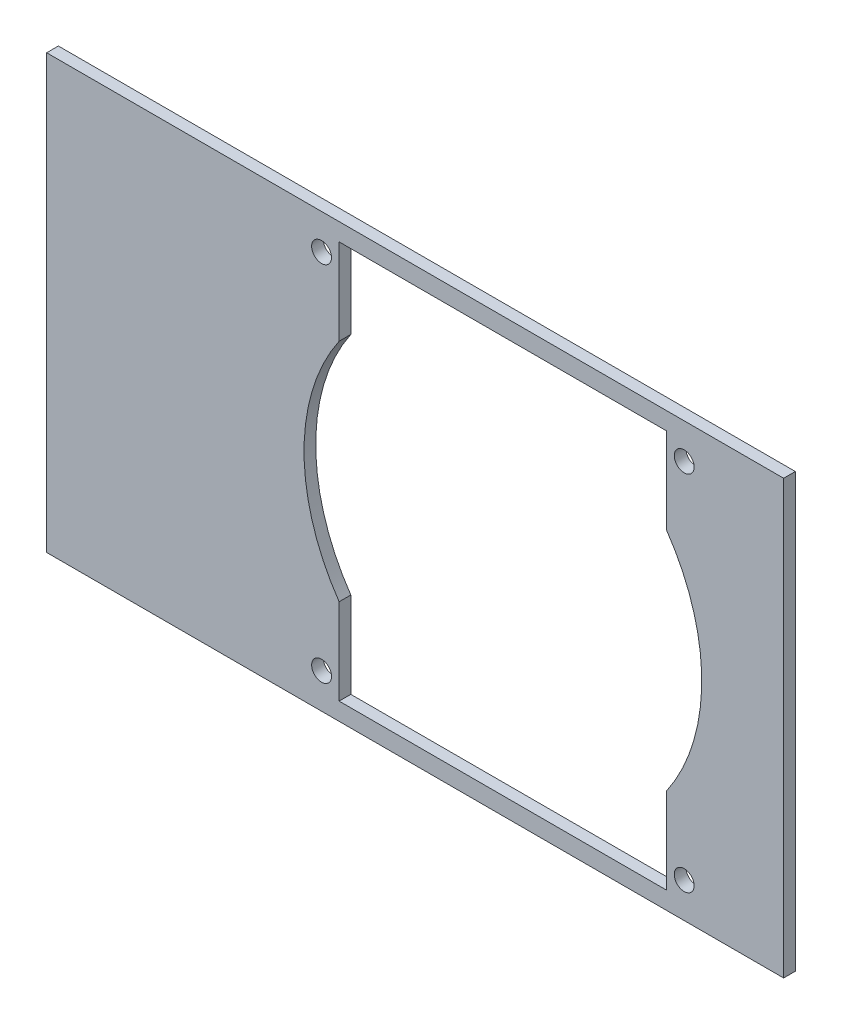
ISO-10303-21;
HEADER;
FILE_DESCRIPTION(('STEP AP214'),'2;1');
FILE_NAME('part.step','',(''),(''),'','','');
FILE_SCHEMA(('AUTOMOTIVE_DESIGN { 1 0 10303 214 1 1 1 1 }'));
ENDSEC;
DATA;
#1=APPLICATION_CONTEXT('core data for automotive mechanical design processes');
#2=APPLICATION_PROTOCOL_DEFINITION('international standard','automotive_design',2000,#1);
#3=PRODUCT_CONTEXT('',#1,'mechanical');
#4=PRODUCT('Part','Part','',(#3));
#5=PRODUCT_RELATED_PRODUCT_CATEGORY('part','',(#4));
#6=PRODUCT_DEFINITION_FORMATION('','',#4);
#7=PRODUCT_DEFINITION_CONTEXT('part definition',#1,'design');
#8=PRODUCT_DEFINITION('design','',#6,#7);
#9=PRODUCT_DEFINITION_SHAPE('','',#8);
#10=(LENGTH_UNIT() NAMED_UNIT(*) SI_UNIT(.MILLI.,.METRE.));
#11=(NAMED_UNIT(*) PLANE_ANGLE_UNIT() SI_UNIT($,.RADIAN.));
#12=(NAMED_UNIT(*) SI_UNIT($,.STERADIAN.) SOLID_ANGLE_UNIT());
#13=UNCERTAINTY_MEASURE_WITH_UNIT(LENGTH_MEASURE(1.E-05),#10,'distance_accuracy_value','');
#14=(GEOMETRIC_REPRESENTATION_CONTEXT(3) GLOBAL_UNCERTAINTY_ASSIGNED_CONTEXT((#13)) GLOBAL_UNIT_ASSIGNED_CONTEXT((#10,
#11,#12)) REPRESENTATION_CONTEXT('',''));
#15=CARTESIAN_POINT('',(0.,0.,0.));
#16=DIRECTION('',(0.,0.,1.));
#17=DIRECTION('',(1.,0.,0.));
#18=AXIS2_PLACEMENT_3D('',#15,#16,#17);
#19=CARTESIAN_POINT('',(0.,0.,2.));
#20=DIRECTION('',(0.,0.,-1.));
#21=DIRECTION('',(-1.,0.,0.));
#22=AXIS2_PLACEMENT_3D('',#19,#20,#21);
#23=PLANE('',#22);
#24=DIRECTION('',(0.,-1.,0.));
#25=VECTOR('',#24,1.);
#26=CARTESIAN_POINT('',(0.,-74.,2.));
#27=LINE('',#26,#25);
#28=CARTESIAN_POINT('',(0.,0.,2.));
#29=VERTEX_POINT('',#28);
#30=CARTESIAN_POINT('',(0.,-74.,2.));
#31=VERTEX_POINT('',#30);
#32=EDGE_CURVE('E190',#29,#31,#27,.T.);
#33=ORIENTED_EDGE('',*,*,#32,.T.);
#34=DIRECTION('',(1.,0.,0.));
#35=VECTOR('',#34,1.);
#36=CARTESIAN_POINT('',(126.,-74.,2.));
#37=LINE('',#36,#35);
#38=CARTESIAN_POINT('',(126.,-74.,2.));
#39=VERTEX_POINT('',#38);
#40=EDGE_CURVE('E193',#31,#39,#37,.T.);
#41=ORIENTED_EDGE('',*,*,#40,.T.);
#42=DIRECTION('',(0.,1.,0.));
#43=VECTOR('',#42,1.);
#44=CARTESIAN_POINT('',(126.,0.,2.));
#45=LINE('',#44,#43);
#46=CARTESIAN_POINT('',(126.,0.,2.));
#47=VERTEX_POINT('',#46);
#48=EDGE_CURVE('E196',#39,#47,#45,.T.);
#49=ORIENTED_EDGE('',*,*,#48,.T.);
#50=DIRECTION('',(-1.,0.,0.));
#51=VECTOR('',#50,1.);
#52=CARTESIAN_POINT('',(0.,0.,2.));
#53=LINE('',#52,#51);
#54=EDGE_CURVE('E198',#47,#29,#53,.T.);
#55=ORIENTED_EDGE('',*,*,#54,.T.);
#56=EDGE_LOOP('',(#33,#41,#49,#55));
#57=FACE_BOUND('',#56,.T.);
#58=DIRECTION('',(0.,-1.,0.));
#59=VECTOR('',#58,1.);
#60=CARTESIAN_POINT('',(50.,-56.287301521986,2.));
#61=LINE('',#60,#59);
#62=CARTESIAN_POINT('',(50.,-56.287301521986,2.));
#63=VERTEX_POINT('',#62);
#64=CARTESIAN_POINT('',(50.,-71.,2.));
#65=VERTEX_POINT('',#64);
#66=EDGE_CURVE('E122',#63,#65,#61,.T.);
#67=ORIENTED_EDGE('',*,*,#66,.F.);
#68=CARTESIAN_POINT('',(78.,-37.,2.));
#69=DIRECTION('',(0.,0.,1.));
#70=DIRECTION('',(1.,0.,0.));
#71=AXIS2_PLACEMENT_3D('',#68,#69,#70);
#72=CIRCLE('',#71,34.);
#73=CARTESIAN_POINT('',(50.,-17.7126984780141,2.));
#74=VERTEX_POINT('',#73);
#75=EDGE_CURVE('E157',#74,#63,#72,.T.);
#76=ORIENTED_EDGE('',*,*,#75,.F.);
#77=DIRECTION('',(0.,-1.,0.));
#78=VECTOR('',#77,1.);
#79=CARTESIAN_POINT('',(50.,-2.99999999999999,2.));
#80=LINE('',#79,#78);
#81=CARTESIAN_POINT('',(50.,-2.99999999999999,2.));
#82=VERTEX_POINT('',#81);
#83=EDGE_CURVE('E155',#82,#74,#80,.T.);
#84=ORIENTED_EDGE('',*,*,#83,.F.);
#85=DIRECTION('',(-1.,0.,0.));
#86=VECTOR('',#85,1.);
#87=CARTESIAN_POINT('',(50.,-2.99999999999999,2.));
#88=LINE('',#87,#86);
#89=CARTESIAN_POINT('',(106.,-2.99999999999999,2.));
#90=VERTEX_POINT('',#89);
#91=EDGE_CURVE('E153',#90,#82,#88,.T.);
#92=ORIENTED_EDGE('',*,*,#91,.F.);
#93=DIRECTION('',(0.,1.,0.));
#94=VECTOR('',#93,1.);
#95=CARTESIAN_POINT('',(106.,-2.99999999999999,2.));
#96=LINE('',#95,#94);
#97=CARTESIAN_POINT('',(106.,-17.712698478014,2.));
#98=VERTEX_POINT('',#97);
#99=EDGE_CURVE('E151',#98,#90,#96,.T.);
#100=ORIENTED_EDGE('',*,*,#99,.F.);
#101=CARTESIAN_POINT('',(78.,-37.,2.));
#102=DIRECTION('',(0.,0.,1.));
#103=DIRECTION('',(1.,0.,0.));
#104=AXIS2_PLACEMENT_3D('',#101,#102,#103);
#105=CIRCLE('',#104,34.);
#106=CARTESIAN_POINT('',(106.,-56.287301521986,2.));
#107=VERTEX_POINT('',#106);
#108=EDGE_CURVE('E146',#107,#98,#105,.T.);
#109=ORIENTED_EDGE('',*,*,#108,.F.);
#110=DIRECTION('',(0.,1.,0.));
#111=VECTOR('',#110,1.);
#112=CARTESIAN_POINT('',(106.,-56.287301521986,2.));
#113=LINE('',#112,#111);
#114=CARTESIAN_POINT('',(106.,-71.,2.));
#115=VERTEX_POINT('',#114);
#116=EDGE_CURVE('E144',#115,#107,#113,.T.);
#117=ORIENTED_EDGE('',*,*,#116,.F.);
#118=DIRECTION('',(1.,0.,0.));
#119=VECTOR('',#118,1.);
#120=CARTESIAN_POINT('',(50.,-71.,2.));
#121=LINE('',#120,#119);
#122=EDGE_CURVE('E130',#65,#115,#121,.T.);
#123=ORIENTED_EDGE('',*,*,#122,.F.);
#124=EDGE_LOOP('',(#67,#76,#84,#92,#100,#109,#117,#123));
#125=FACE_BOUND('',#124,.T.);
#126=CARTESIAN_POINT('',(47.,-6.00000000000002,2.));
#127=DIRECTION('',(0.,0.,1.));
#128=DIRECTION('',(1.,0.,0.));
#129=AXIS2_PLACEMENT_3D('',#126,#127,#128);
#130=CIRCLE('',#129,1.7);
#131=CARTESIAN_POINT('',(48.7,-6.00000000000002,2.));
#132=VERTEX_POINT('',#131);
#133=EDGE_CURVE('E160',#132,#132,#130,.T.);
#134=ORIENTED_EDGE('',*,*,#133,.F.);
#135=EDGE_LOOP('',(#134));
#136=FACE_BOUND('',#135,.T.);
#137=CARTESIAN_POINT('',(109.,-6.00000000000002,2.));
#138=DIRECTION('',(0.,0.,1.));
#139=DIRECTION('',(1.,0.,0.));
#140=AXIS2_PLACEMENT_3D('',#137,#138,#139);
#141=CIRCLE('',#140,1.70000000000001);
#142=CARTESIAN_POINT('',(110.7,-6.00000000000002,2.));
#143=VERTEX_POINT('',#142);
#144=EDGE_CURVE('E318',#143,#143,#141,.T.);
#145=ORIENTED_EDGE('',*,*,#144,.F.);
#146=EDGE_LOOP('',(#145));
#147=FACE_BOUND('',#146,.T.);
#148=CARTESIAN_POINT('',(47.,-68.,2.));
#149=DIRECTION('',(0.,0.,1.));
#150=DIRECTION('',(1.,0.,0.));
#151=AXIS2_PLACEMENT_3D('',#148,#149,#150);
#152=CIRCLE('',#151,1.7);
#153=CARTESIAN_POINT('',(48.7,-68.,2.));
#154=VERTEX_POINT('',#153);
#155=EDGE_CURVE('E312',#154,#154,#152,.T.);
#156=ORIENTED_EDGE('',*,*,#155,.F.);
#157=EDGE_LOOP('',(#156));
#158=FACE_BOUND('',#157,.T.);
#159=CARTESIAN_POINT('',(109.,-68.,2.));
#160=DIRECTION('',(0.,0.,1.));
#161=DIRECTION('',(1.,0.,0.));
#162=AXIS2_PLACEMENT_3D('',#159,#160,#161);
#163=CIRCLE('',#162,1.7);
#164=CARTESIAN_POINT('',(110.7,-68.,2.));
#165=VERTEX_POINT('',#164);
#166=EDGE_CURVE('E303',#165,#165,#163,.T.);
#167=ORIENTED_EDGE('',*,*,#166,.F.);
#168=EDGE_LOOP('',(#167));
#169=FACE_BOUND('',#168,.T.);
#170=ADVANCED_FACE('F33',(#57,#125,#136,#147,#158,#169),#23,.F.);
#171=CARTESIAN_POINT('',(0.,0.,0.));
#172=DIRECTION('',(0.,0.,-1.));
#173=DIRECTION('',(-1.,0.,0.));
#174=AXIS2_PLACEMENT_3D('',#171,#172,#173);
#175=PLANE('',#174);
#176=CARTESIAN_POINT('',(47.,-68.,0.));
#177=DIRECTION('',(0.,0.,1.));
#178=DIRECTION('',(1.,0.,0.));
#179=AXIS2_PLACEMENT_3D('',#176,#177,#178);
#180=CIRCLE('',#179,1.7);
#181=CARTESIAN_POINT('',(48.7,-68.,0.));
#182=VERTEX_POINT('',#181);
#183=EDGE_CURVE('E309',#182,#182,#180,.T.);
#184=ORIENTED_EDGE('',*,*,#183,.T.);
#185=EDGE_LOOP('',(#184));
#186=FACE_BOUND('',#185,.T.);
#187=CARTESIAN_POINT('',(47.,-6.00000000000002,0.));
#188=DIRECTION('',(0.,0.,1.));
#189=DIRECTION('',(1.,0.,0.));
#190=AXIS2_PLACEMENT_3D('',#187,#188,#189);
#191=CIRCLE('',#190,1.7);
#192=CARTESIAN_POINT('',(48.7,-6.00000000000002,0.));
#193=VERTEX_POINT('',#192);
#194=EDGE_CURVE('E321',#193,#193,#191,.T.);
#195=ORIENTED_EDGE('',*,*,#194,.T.);
#196=EDGE_LOOP('',(#195));
#197=FACE_BOUND('',#196,.T.);
#198=DIRECTION('',(0.,-1.,0.));
#199=VECTOR('',#198,1.);
#200=CARTESIAN_POINT('',(0.,-74.,0.));
#201=LINE('',#200,#199);
#202=CARTESIAN_POINT('',(0.,0.,0.));
#203=VERTEX_POINT('',#202);
#204=CARTESIAN_POINT('',(0.,-74.,0.));
#205=VERTEX_POINT('',#204);
#206=EDGE_CURVE('E138',#203,#205,#201,.T.);
#207=ORIENTED_EDGE('',*,*,#206,.F.);
#208=DIRECTION('',(-1.,0.,0.));
#209=VECTOR('',#208,1.);
#210=CARTESIAN_POINT('',(0.,0.,0.));
#211=LINE('',#210,#209);
#212=CARTESIAN_POINT('',(126.,0.,0.));
#213=VERTEX_POINT('',#212);
#214=EDGE_CURVE('E194',#213,#203,#211,.T.);
#215=ORIENTED_EDGE('',*,*,#214,.F.);
#216=DIRECTION('',(0.,1.,0.));
#217=VECTOR('',#216,1.);
#218=CARTESIAN_POINT('',(126.,0.,0.));
#219=LINE('',#218,#217);
#220=CARTESIAN_POINT('',(126.,-74.,0.));
#221=VERTEX_POINT('',#220);
#222=EDGE_CURVE('E205',#221,#213,#219,.T.);
#223=ORIENTED_EDGE('',*,*,#222,.F.);
#224=DIRECTION('',(1.,0.,0.));
#225=VECTOR('',#224,1.);
#226=CARTESIAN_POINT('',(126.,-74.,0.));
#227=LINE('',#226,#225);
#228=EDGE_CURVE('E203',#205,#221,#227,.T.);
#229=ORIENTED_EDGE('',*,*,#228,.F.);
#230=EDGE_LOOP('',(#207,#215,#223,#229));
#231=FACE_BOUND('',#230,.T.);
#232=CARTESIAN_POINT('',(78.,-37.,0.));
#233=DIRECTION('',(0.,0.,1.));
#234=DIRECTION('',(1.,0.,0.));
#235=AXIS2_PLACEMENT_3D('',#232,#233,#234);
#236=CIRCLE('',#235,34.);
#237=CARTESIAN_POINT('',(50.,-17.7126984780141,0.));
#238=VERTEX_POINT('',#237);
#239=CARTESIAN_POINT('',(50.,-56.287301521986,0.));
#240=VERTEX_POINT('',#239);
#241=EDGE_CURVE('E131',#238,#240,#236,.T.);
#242=ORIENTED_EDGE('',*,*,#241,.T.);
#243=DIRECTION('',(0.,-1.,0.));
#244=VECTOR('',#243,1.);
#245=CARTESIAN_POINT('',(50.,-56.287301521986,0.));
#246=LINE('',#245,#244);
#247=CARTESIAN_POINT('',(50.,-71.,0.));
#248=VERTEX_POINT('',#247);
#249=EDGE_CURVE('E56',#240,#248,#246,.T.);
#250=ORIENTED_EDGE('',*,*,#249,.T.);
#251=DIRECTION('',(1.,0.,0.));
#252=VECTOR('',#251,1.);
#253=CARTESIAN_POINT('',(50.,-71.,0.));
#254=LINE('',#253,#252);
#255=CARTESIAN_POINT('',(106.,-71.,0.));
#256=VERTEX_POINT('',#255);
#257=EDGE_CURVE('E137',#248,#256,#254,.T.);
#258=ORIENTED_EDGE('',*,*,#257,.T.);
#259=DIRECTION('',(0.,1.,0.));
#260=VECTOR('',#259,1.);
#261=CARTESIAN_POINT('',(106.,-56.287301521986,0.));
#262=LINE('',#261,#260);
#263=CARTESIAN_POINT('',(106.,-56.287301521986,0.));
#264=VERTEX_POINT('',#263);
#265=EDGE_CURVE('E162',#256,#264,#262,.T.);
#266=ORIENTED_EDGE('',*,*,#265,.T.);
#267=CARTESIAN_POINT('',(78.,-37.,0.));
#268=DIRECTION('',(0.,0.,1.));
#269=DIRECTION('',(1.,0.,0.));
#270=AXIS2_PLACEMENT_3D('',#267,#268,#269);
#271=CIRCLE('',#270,34.);
#272=CARTESIAN_POINT('',(106.,-17.712698478014,0.));
#273=VERTEX_POINT('',#272);
#274=EDGE_CURVE('E165',#264,#273,#271,.T.);
#275=ORIENTED_EDGE('',*,*,#274,.T.);
#276=DIRECTION('',(0.,1.,0.));
#277=VECTOR('',#276,1.);
#278=CARTESIAN_POINT('',(106.,-2.99999999999999,0.));
#279=LINE('',#278,#277);
#280=CARTESIAN_POINT('',(106.,-2.99999999999999,0.));
#281=VERTEX_POINT('',#280);
#282=EDGE_CURVE('E168',#273,#281,#279,.T.);
#283=ORIENTED_EDGE('',*,*,#282,.T.);
#284=DIRECTION('',(-1.,0.,0.));
#285=VECTOR('',#284,1.);
#286=CARTESIAN_POINT('',(50.,-2.99999999999999,0.));
#287=LINE('',#286,#285);
#288=CARTESIAN_POINT('',(50.,-2.99999999999999,0.));
#289=VERTEX_POINT('',#288);
#290=EDGE_CURVE('E171',#281,#289,#287,.T.);
#291=ORIENTED_EDGE('',*,*,#290,.T.);
#292=DIRECTION('',(0.,-1.,0.));
#293=VECTOR('',#292,1.);
#294=CARTESIAN_POINT('',(50.,-2.99999999999999,0.));
#295=LINE('',#294,#293);
#296=EDGE_CURVE('E174',#289,#238,#295,.T.);
#297=ORIENTED_EDGE('',*,*,#296,.T.);
#298=EDGE_LOOP('',(#242,#250,#258,#266,#275,#283,#291,#297));
#299=FACE_BOUND('',#298,.T.);
#300=CARTESIAN_POINT('',(109.,-6.00000000000002,0.));
#301=DIRECTION('',(0.,0.,1.));
#302=DIRECTION('',(1.,0.,0.));
#303=AXIS2_PLACEMENT_3D('',#300,#301,#302);
#304=CIRCLE('',#303,1.70000000000001);
#305=CARTESIAN_POINT('',(110.7,-6.00000000000002,0.));
#306=VERTEX_POINT('',#305);
#307=EDGE_CURVE('E315',#306,#306,#304,.T.);
#308=ORIENTED_EDGE('',*,*,#307,.T.);
#309=EDGE_LOOP('',(#308));
#310=FACE_BOUND('',#309,.T.);
#311=CARTESIAN_POINT('',(109.,-68.,0.));
#312=DIRECTION('',(0.,0.,1.));
#313=DIRECTION('',(1.,0.,0.));
#314=AXIS2_PLACEMENT_3D('',#311,#312,#313);
#315=CIRCLE('',#314,1.7);
#316=CARTESIAN_POINT('',(110.7,-68.,0.));
#317=VERTEX_POINT('',#316);
#318=EDGE_CURVE('E306',#317,#317,#315,.T.);
#319=ORIENTED_EDGE('',*,*,#318,.T.);
#320=EDGE_LOOP('',(#319));
#321=FACE_BOUND('',#320,.T.);
#322=ADVANCED_FACE('F223',(#186,#197,#231,#299,#310,#321),#175,.T.);
#323=CARTESIAN_POINT('',(0.,-74.,2.));
#324=DIRECTION('',(1.,0.,0.));
#325=DIRECTION('',(0.,0.,-1.));
#326=AXIS2_PLACEMENT_3D('',#323,#324,#325);
#327=PLANE('',#326);
#328=ORIENTED_EDGE('',*,*,#206,.T.);
#329=DIRECTION('',(0.,0.,-1.));
#330=VECTOR('',#329,1.);
#331=CARTESIAN_POINT('',(0.,-74.,2.));
#332=LINE('',#331,#330);
#333=EDGE_CURVE('E11',#31,#205,#332,.T.);
#334=ORIENTED_EDGE('',*,*,#333,.F.);
#335=ORIENTED_EDGE('',*,*,#32,.F.);
#336=DIRECTION('',(0.,0.,-1.));
#337=VECTOR('',#336,1.);
#338=CARTESIAN_POINT('',(0.,0.,2.));
#339=LINE('',#338,#337);
#340=EDGE_CURVE('E200',#29,#203,#339,.T.);
#341=ORIENTED_EDGE('',*,*,#340,.T.);
#342=EDGE_LOOP('',(#328,#334,#335,#341));
#343=FACE_BOUND('',#342,.T.);
#344=ADVANCED_FACE('F35',(#343),#327,.F.);
#345=CARTESIAN_POINT('',(126.,-74.,2.));
#346=DIRECTION('',(0.,1.,0.));
#347=DIRECTION('',(-1.,0.,0.));
#348=AXIS2_PLACEMENT_3D('',#345,#346,#347);
#349=PLANE('',#348);
#350=ORIENTED_EDGE('',*,*,#228,.T.);
#351=DIRECTION('',(0.,0.,-1.));
#352=VECTOR('',#351,1.);
#353=CARTESIAN_POINT('',(126.,-74.,2.));
#354=LINE('',#353,#352);
#355=EDGE_CURVE('E41',#39,#221,#354,.T.);
#356=ORIENTED_EDGE('',*,*,#355,.F.);
#357=ORIENTED_EDGE('',*,*,#40,.F.);
#358=ORIENTED_EDGE('',*,*,#333,.T.);
#359=EDGE_LOOP('',(#350,#356,#357,#358));
#360=FACE_BOUND('',#359,.T.);
#361=ADVANCED_FACE('F233',(#360),#349,.F.);
#362=CARTESIAN_POINT('',(126.,0.,2.));
#363=DIRECTION('',(-1.,0.,0.));
#364=DIRECTION('',(0.,-1.,0.));
#365=AXIS2_PLACEMENT_3D('',#362,#363,#364);
#366=PLANE('',#365);
#367=ORIENTED_EDGE('',*,*,#222,.T.);
#368=DIRECTION('',(0.,0.,-1.));
#369=VECTOR('',#368,1.);
#370=CARTESIAN_POINT('',(126.,0.,2.));
#371=LINE('',#370,#369);
#372=EDGE_CURVE('E210',#47,#213,#371,.T.);
#373=ORIENTED_EDGE('',*,*,#372,.F.);
#374=ORIENTED_EDGE('',*,*,#48,.F.);
#375=ORIENTED_EDGE('',*,*,#355,.T.);
#376=EDGE_LOOP('',(#367,#373,#374,#375));
#377=FACE_BOUND('',#376,.T.);
#378=ADVANCED_FACE('F217',(#377),#366,.F.);
#379=CARTESIAN_POINT('',(0.,0.,2.));
#380=DIRECTION('',(0.,-1.,0.));
#381=DIRECTION('',(1.,0.,0.));
#382=AXIS2_PLACEMENT_3D('',#379,#380,#381);
#383=PLANE('',#382);
#384=ORIENTED_EDGE('',*,*,#214,.T.);
#385=ORIENTED_EDGE('',*,*,#340,.F.);
#386=ORIENTED_EDGE('',*,*,#54,.F.);
#387=ORIENTED_EDGE('',*,*,#372,.T.);
#388=EDGE_LOOP('',(#384,#385,#386,#387));
#389=FACE_BOUND('',#388,.T.);
#390=ADVANCED_FACE('F227',(#389),#383,.F.);
#391=CARTESIAN_POINT('',(50.,-56.287301521986,2.));
#392=DIRECTION('',(1.,0.,0.));
#393=DIRECTION('',(0.,0.,-1.));
#394=AXIS2_PLACEMENT_3D('',#391,#392,#393);
#395=PLANE('',#394);
#396=ORIENTED_EDGE('',*,*,#249,.F.);
#397=DIRECTION('',(0.,0.,-1.));
#398=VECTOR('',#397,1.);
#399=CARTESIAN_POINT('',(50.,-56.287301521986,2.));
#400=LINE('',#399,#398);
#401=EDGE_CURVE('E126',#63,#240,#400,.T.);
#402=ORIENTED_EDGE('',*,*,#401,.F.);
#403=ORIENTED_EDGE('',*,*,#66,.T.);
#404=DIRECTION('',(0.,0.,-1.));
#405=VECTOR('',#404,1.);
#406=CARTESIAN_POINT('',(50.,-71.,2.));
#407=LINE('',#406,#405);
#408=EDGE_CURVE('E125',#65,#248,#407,.T.);
#409=ORIENTED_EDGE('',*,*,#408,.T.);
#410=EDGE_LOOP('',(#396,#402,#403,#409));
#411=FACE_BOUND('',#410,.T.);
#412=ADVANCED_FACE('F124',(#411),#395,.T.);
#413=CARTESIAN_POINT('',(50.,-71.,2.));
#414=DIRECTION('',(0.,1.,0.));
#415=DIRECTION('',(0.,0.,1.));
#416=AXIS2_PLACEMENT_3D('',#413,#414,#415);
#417=PLANE('',#416);
#418=ORIENTED_EDGE('',*,*,#257,.F.);
#419=ORIENTED_EDGE('',*,*,#408,.F.);
#420=ORIENTED_EDGE('',*,*,#122,.T.);
#421=DIRECTION('',(0.,0.,-1.));
#422=VECTOR('',#421,1.);
#423=CARTESIAN_POINT('',(106.,-71.,2.));
#424=LINE('',#423,#422);
#425=EDGE_CURVE('E139',#115,#256,#424,.T.);
#426=ORIENTED_EDGE('',*,*,#425,.T.);
#427=EDGE_LOOP('',(#418,#419,#420,#426));
#428=FACE_BOUND('',#427,.T.);
#429=ADVANCED_FACE('F134',(#428),#417,.T.);
#430=CARTESIAN_POINT('',(106.,-56.287301521986,2.));
#431=DIRECTION('',(-1.,0.,0.));
#432=DIRECTION('',(0.,0.,1.));
#433=AXIS2_PLACEMENT_3D('',#430,#431,#432);
#434=PLANE('',#433);
#435=ORIENTED_EDGE('',*,*,#265,.F.);
#436=ORIENTED_EDGE('',*,*,#425,.F.);
#437=ORIENTED_EDGE('',*,*,#116,.T.);
#438=DIRECTION('',(0.,0.,-1.));
#439=VECTOR('',#438,1.);
#440=CARTESIAN_POINT('',(106.,-56.287301521986,2.));
#441=LINE('',#440,#439);
#442=EDGE_CURVE('E187',#107,#264,#441,.T.);
#443=ORIENTED_EDGE('',*,*,#442,.T.);
#444=EDGE_LOOP('',(#435,#436,#437,#443));
#445=FACE_BOUND('',#444,.T.);
#446=ADVANCED_FACE('F257',(#445),#434,.T.);
#447=CARTESIAN_POINT('',(78.,-37.,2.));
#448=DIRECTION('',(0.,0.,-1.));
#449=DIRECTION('',(-1.,0.,0.));
#450=AXIS2_PLACEMENT_3D('',#447,#448,#449);
#451=CYLINDRICAL_SURFACE('',#450,34.);
#452=ORIENTED_EDGE('',*,*,#274,.F.);
#453=ORIENTED_EDGE('',*,*,#442,.F.);
#454=ORIENTED_EDGE('',*,*,#108,.T.);
#455=DIRECTION('',(0.,0.,-1.));
#456=VECTOR('',#455,1.);
#457=CARTESIAN_POINT('',(106.,-17.712698478014,2.));
#458=LINE('',#457,#456);
#459=EDGE_CURVE('E185',#98,#273,#458,.T.);
#460=ORIENTED_EDGE('',*,*,#459,.T.);
#461=EDGE_LOOP('',(#452,#453,#454,#460));
#462=FACE_BOUND('',#461,.T.);
#463=ADVANCED_FACE('F261',(#462),#451,.F.);
#464=CARTESIAN_POINT('',(106.,-2.99999999999999,2.));
#465=DIRECTION('',(-1.,0.,0.));
#466=DIRECTION('',(0.,-1.,0.));
#467=AXIS2_PLACEMENT_3D('',#464,#465,#466);
#468=PLANE('',#467);
#469=ORIENTED_EDGE('',*,*,#282,.F.);
#470=ORIENTED_EDGE('',*,*,#459,.F.);
#471=ORIENTED_EDGE('',*,*,#99,.T.);
#472=DIRECTION('',(0.,0.,-1.));
#473=VECTOR('',#472,1.);
#474=CARTESIAN_POINT('',(106.,-2.99999999999999,2.));
#475=LINE('',#474,#473);
#476=EDGE_CURVE('E183',#90,#281,#475,.T.);
#477=ORIENTED_EDGE('',*,*,#476,.T.);
#478=EDGE_LOOP('',(#469,#470,#471,#477));
#479=FACE_BOUND('',#478,.T.);
#480=ADVANCED_FACE('F267',(#479),#468,.T.);
#481=CARTESIAN_POINT('',(50.,-2.99999999999999,2.));
#482=DIRECTION('',(0.,-1.,0.));
#483=DIRECTION('',(1.,0.,0.));
#484=AXIS2_PLACEMENT_3D('',#481,#482,#483);
#485=PLANE('',#484);
#486=ORIENTED_EDGE('',*,*,#290,.F.);
#487=ORIENTED_EDGE('',*,*,#476,.F.);
#488=ORIENTED_EDGE('',*,*,#91,.T.);
#489=DIRECTION('',(0.,0.,-1.));
#490=VECTOR('',#489,1.);
#491=CARTESIAN_POINT('',(50.,-2.99999999999999,2.));
#492=LINE('',#491,#490);
#493=EDGE_CURVE('E181',#82,#289,#492,.T.);
#494=ORIENTED_EDGE('',*,*,#493,.T.);
#495=EDGE_LOOP('',(#486,#487,#488,#494));
#496=FACE_BOUND('',#495,.T.);
#497=ADVANCED_FACE('F271',(#496),#485,.T.);
#498=CARTESIAN_POINT('',(50.,-2.99999999999999,2.));
#499=DIRECTION('',(1.,0.,0.));
#500=DIRECTION('',(0.,0.,-1.));
#501=AXIS2_PLACEMENT_3D('',#498,#499,#500);
#502=PLANE('',#501);
#503=ORIENTED_EDGE('',*,*,#296,.F.);
#504=ORIENTED_EDGE('',*,*,#493,.F.);
#505=ORIENTED_EDGE('',*,*,#83,.T.);
#506=DIRECTION('',(0.,0.,-1.));
#507=VECTOR('',#506,1.);
#508=CARTESIAN_POINT('',(50.,-17.7126984780141,2.));
#509=LINE('',#508,#507);
#510=EDGE_CURVE('E48',#74,#238,#509,.T.);
#511=ORIENTED_EDGE('',*,*,#510,.T.);
#512=EDGE_LOOP('',(#503,#504,#505,#511));
#513=FACE_BOUND('',#512,.T.);
#514=ADVANCED_FACE('F275',(#513),#502,.T.);
#515=CARTESIAN_POINT('',(78.,-37.,2.));
#516=DIRECTION('',(0.,0.,-1.));
#517=DIRECTION('',(-1.,0.,0.));
#518=AXIS2_PLACEMENT_3D('',#515,#516,#517);
#519=CYLINDRICAL_SURFACE('',#518,34.);
#520=ORIENTED_EDGE('',*,*,#241,.F.);
#521=ORIENTED_EDGE('',*,*,#510,.F.);
#522=ORIENTED_EDGE('',*,*,#75,.T.);
#523=ORIENTED_EDGE('',*,*,#401,.T.);
#524=EDGE_LOOP('',(#520,#521,#522,#523));
#525=FACE_BOUND('',#524,.T.);
#526=ADVANCED_FACE('F279',(#525),#519,.F.);
#527=CARTESIAN_POINT('',(47.,-6.00000000000002,2.));
#528=DIRECTION('',(0.,0.,-1.));
#529=DIRECTION('',(-1.,0.,0.));
#530=AXIS2_PLACEMENT_3D('',#527,#528,#529);
#531=CYLINDRICAL_SURFACE('',#530,1.7);
#532=ORIENTED_EDGE('',*,*,#133,.T.);
#533=EDGE_LOOP('',(#532));
#534=FACE_BOUND('',#533,.T.);
#535=ORIENTED_EDGE('',*,*,#194,.F.);
#536=EDGE_LOOP('',(#535));
#537=FACE_BOUND('',#536,.T.);
#538=ADVANCED_FACE('F283',(#534,#537),#531,.F.);
#539=CARTESIAN_POINT('',(109.,-6.00000000000002,2.));
#540=DIRECTION('',(0.,0.,-1.));
#541=DIRECTION('',(-1.,0.,0.));
#542=AXIS2_PLACEMENT_3D('',#539,#540,#541);
#543=CYLINDRICAL_SURFACE('',#542,1.70000000000001);
#544=ORIENTED_EDGE('',*,*,#144,.T.);
#545=EDGE_LOOP('',(#544));
#546=FACE_BOUND('',#545,.T.);
#547=ORIENTED_EDGE('',*,*,#307,.F.);
#548=EDGE_LOOP('',(#547));
#549=FACE_BOUND('',#548,.T.);
#550=ADVANCED_FACE('F286',(#546,#549),#543,.F.);
#551=CARTESIAN_POINT('',(47.,-68.,2.));
#552=DIRECTION('',(0.,0.,-1.));
#553=DIRECTION('',(-1.,0.,0.));
#554=AXIS2_PLACEMENT_3D('',#551,#552,#553);
#555=CYLINDRICAL_SURFACE('',#554,1.7);
#556=ORIENTED_EDGE('',*,*,#155,.T.);
#557=EDGE_LOOP('',(#556));
#558=FACE_BOUND('',#557,.T.);
#559=ORIENTED_EDGE('',*,*,#183,.F.);
#560=EDGE_LOOP('',(#559));
#561=FACE_BOUND('',#560,.T.);
#562=ADVANCED_FACE('F290',(#558,#561),#555,.F.);
#563=CARTESIAN_POINT('',(109.,-68.,2.));
#564=DIRECTION('',(0.,0.,-1.));
#565=DIRECTION('',(-1.,0.,0.));
#566=AXIS2_PLACEMENT_3D('',#563,#564,#565);
#567=CYLINDRICAL_SURFACE('',#566,1.7);
#568=ORIENTED_EDGE('',*,*,#166,.T.);
#569=EDGE_LOOP('',(#568));
#570=FACE_BOUND('',#569,.T.);
#571=ORIENTED_EDGE('',*,*,#318,.F.);
#572=EDGE_LOOP('',(#571));
#573=FACE_BOUND('',#572,.T.);
#574=ADVANCED_FACE('F294',(#570,#573),#567,.F.);
#575=CLOSED_SHELL('',(#170,#322,#344,#361,#378,#390,#412,#429,#446,#463,#480,#497,#514,#526,
#538,#550,#562,#574));
#576=MANIFOLD_SOLID_BREP('B2',#575);
#577=ADVANCED_BREP_SHAPE_REPRESENTATION('',(#18,#576),#14);
#578=SHAPE_DEFINITION_REPRESENTATION(#9,#577);
ENDSEC;
END-ISO-10303-21;
